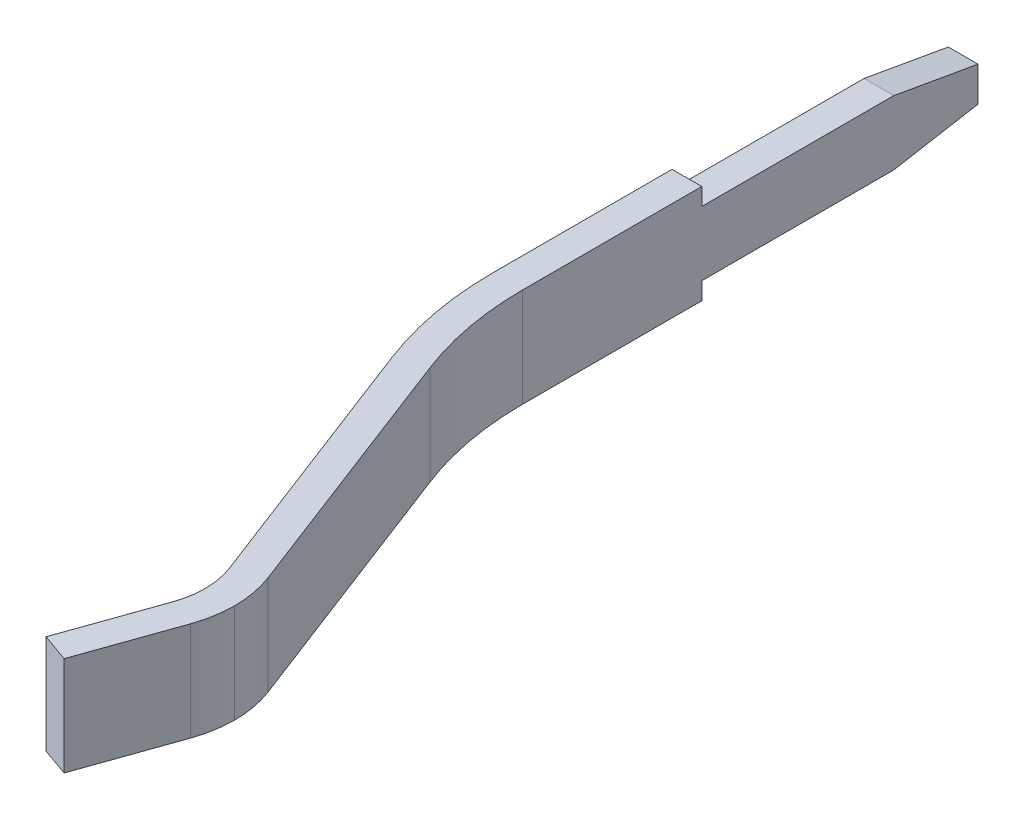
ISO-10303-21;
HEADER;
FILE_DESCRIPTION(('STEP AP214'),'2;1');
FILE_NAME('part.step','',(''),(''),'','','');
FILE_SCHEMA(('AUTOMOTIVE_DESIGN { 1 0 10303 214 1 1 1 1 }'));
ENDSEC;
DATA;
#1=APPLICATION_CONTEXT('core data for automotive mechanical design processes');
#2=APPLICATION_PROTOCOL_DEFINITION('international standard','automotive_design',2000,#1);
#3=PRODUCT_CONTEXT('',#1,'mechanical');
#4=PRODUCT('Part','Part','',(#3));
#5=PRODUCT_RELATED_PRODUCT_CATEGORY('part','',(#4));
#6=PRODUCT_DEFINITION_FORMATION('','',#4);
#7=PRODUCT_DEFINITION_CONTEXT('part definition',#1,'design');
#8=PRODUCT_DEFINITION('design','',#6,#7);
#9=PRODUCT_DEFINITION_SHAPE('','',#8);
#10=(LENGTH_UNIT() NAMED_UNIT(*) SI_UNIT(.MILLI.,.METRE.));
#11=(NAMED_UNIT(*) PLANE_ANGLE_UNIT() SI_UNIT($,.RADIAN.));
#12=(NAMED_UNIT(*) SI_UNIT($,.STERADIAN.) SOLID_ANGLE_UNIT());
#13=UNCERTAINTY_MEASURE_WITH_UNIT(LENGTH_MEASURE(1.E-05),#10,'distance_accuracy_value','');
#14=(GEOMETRIC_REPRESENTATION_CONTEXT(3) GLOBAL_UNCERTAINTY_ASSIGNED_CONTEXT((#13)) GLOBAL_UNIT_ASSIGNED_CONTEXT((#10,
#11,#12)) REPRESENTATION_CONTEXT('',''));
#15=CARTESIAN_POINT('',(0.,0.,0.));
#16=DIRECTION('',(0.,0.,1.));
#17=DIRECTION('',(1.,0.,0.));
#18=AXIS2_PLACEMENT_3D('',#15,#16,#17);
#19=CARTESIAN_POINT('',(137.95048954306,19.902694125595,6.525238669739));
#20=DIRECTION('',(-4.371138828674E-08,1.,0.));
#21=DIRECTION('',(1.,4.37113882867399E-08,-4.37114091299599E-08));
#22=AXIS2_PLACEMENT_3D('',#19,#20,#21);
#23=CYLINDRICAL_SURFACE('',#22,0.85);
#24=CARTESIAN_POINT('',(138.75187724079,19.9026941606245,6.80857196804195));
#25=CARTESIAN_POINT('',(138.800489549435,19.9026941627494,6.67107557654959));
#26=CARTESIAN_POINT('',(138.80048954306,19.9026941627494,6.525238632584));
#27=B_SPLINE_CURVE_WITH_KNOTS('',2,(#24,#25,#26),.UNSPECIFIED.,.F.,.F.,(3,3),(0.,1.),.UNSPECIFIED.);
#28=CARTESIAN_POINT('',(138.751877240787,19.9026941606248,6.80857196804103));
#29=VERTEX_POINT('',#28);
#30=CARTESIAN_POINT('',(138.80048954306,19.9026941627497,6.5252386325842));
#31=VERTEX_POINT('',#30);
#32=EDGE_CURVE('E1189',#29,#31,#27,.T.);
#33=ORIENTED_EDGE('',*,*,#32,.F.);
#34=CARTESIAN_POINT('',(138.75187724079,19.902694160625,6.80857196804194));
#35=DIRECTION('',(-4.37113956142098E-08,0.999999999999999,0.));
#36=VECTOR('',#35,1.);
#37=LINE('',#34,#36);
#38=CARTESIAN_POINT('',(138.751877197074,20.9026941606248,6.80857196804246));
#39=VERTEX_POINT('',#38);
#40=EDGE_CURVE('E163',#29,#39,#37,.T.);
#41=ORIENTED_EDGE('',*,*,#40,.T.);
#42=CARTESIAN_POINT('',(138.80048949934,20.9026941627494,6.525238632584));
#43=CARTESIAN_POINT('',(138.800489505715,20.9026941627494,6.67107557654959));
#44=CARTESIAN_POINT('',(138.75187719707,20.9026941606245,6.80857196804195));
#45=B_SPLINE_CURVE_WITH_KNOTS('',2,(#42,#43,#44),.UNSPECIFIED.,.F.,.F.,(3,3),(0.,1.),.UNSPECIFIED.);
#46=CARTESIAN_POINT('',(138.800489499346,20.9026941627497,6.5252386325842));
#47=VERTEX_POINT('',#46);
#48=EDGE_CURVE('E154',#47,#39,#45,.T.);
#49=ORIENTED_EDGE('',*,*,#48,.F.);
#50=CARTESIAN_POINT('',(138.800489499349,20.90269416275,6.5252386325843));
#51=DIRECTION('',(4.37113678586342E-08,-0.999999999999999,0.));
#52=VECTOR('',#51,1.);
#53=LINE('',#50,#52);
#54=EDGE_CURVE('E160',#47,#31,#53,.T.);
#55=ORIENTED_EDGE('',*,*,#54,.T.);
#56=EDGE_LOOP('',(#33,#41,#49,#55));
#57=FACE_BOUND('',#56,.T.);
#58=ADVANCED_FACE('F18',(#57),#23,.F.);
#59=CARTESIAN_POINT('',(140.60074239434,19.902694241441,0.499993243463));
#60=DIRECTION('',(4.37114091771E-08,0.,1.));
#61=DIRECTION('',(4.37113882867448E-08,-1.,0.));
#62=AXIS2_PLACEMENT_3D('',#59,#60,#61);
#63=PLANE('',#62);
#64=CARTESIAN_POINT('',(137.49187696503,19.9026941055481,0.49999337935589));
#65=DIRECTION('',(0.999999999999998,4.37113886753126E-08,-4.37114175873706E-08));
#66=VECTOR('',#65,1.);
#67=LINE('',#64,#66);
#68=CARTESIAN_POINT('',(137.491876965027,19.9026941055486,0.499993379355944));
#69=VERTEX_POINT('',#68);
#70=CARTESIAN_POINT('',(137.791876965031,19.9026941186618,0.499993366242733));
#71=VERTEX_POINT('',#70);
#72=EDGE_CURVE('E961',#69,#71,#67,.T.);
#73=ORIENTED_EDGE('',*,*,#72,.F.);
#74=CARTESIAN_POINT('',(137.49187696503,19.902694105549,0.499993379355889));
#75=DIRECTION('',(-4.37113837189628E-08,0.999999999999999,0.));
#76=VECTOR('',#75,1.);
#77=LINE('',#74,#76);
#78=CARTESIAN_POINT('',(137.491876957379,20.0776941055486,0.499993379355945));
#79=VERTEX_POINT('',#78);
#80=EDGE_CURVE('E1150',#69,#79,#77,.T.);
#81=ORIENTED_EDGE('',*,*,#80,.T.);
#82=CARTESIAN_POINT('',(137.49187695738,20.0776941055482,0.499993379355889));
#83=DIRECTION('',(0.999999999999998,4.37113886753126E-08,-4.37114092751539E-08));
#84=VECTOR('',#83,1.);
#85=LINE('',#82,#84);
#86=CARTESIAN_POINT('',(137.791876957381,20.0776941186618,0.499993366242733));
#87=VERTEX_POINT('',#86);
#88=EDGE_CURVE('E1140',#79,#87,#85,.T.);
#89=ORIENTED_EDGE('',*,*,#88,.T.);
#90=CARTESIAN_POINT('',(137.791876965032,19.902694118662,0.499993366242996));
#91=DIRECTION('',(-4.37113837189636E-08,0.999999999999999,0.));
#92=VECTOR('',#91,1.);
#93=LINE('',#90,#92);
#94=EDGE_CURVE('E167',#71,#87,#93,.T.);
#95=ORIENTED_EDGE('',*,*,#94,.F.);
#96=EDGE_LOOP('',(#73,#81,#89,#95));
#97=FACE_BOUND('',#96,.T.);
#98=ADVANCED_FACE('F1110',(#97),#63,.F.);
#99=CARTESIAN_POINT('',(140.60074230189,20.077694241441,-1.440006756537));
#100=DIRECTION('',(-4.371138828674E-08,1.,0.));
#101=DIRECTION('',(0.,0.,1.));
#102=AXIS2_PLACEMENT_3D('',#99,#100,#101);
#103=PLANE('',#102);
#104=ORIENTED_EDGE('',*,*,#88,.F.);
#105=CARTESIAN_POINT('',(137.49187695738,20.0776941055482,0.499993379356));
#106=DIRECTION('',(-4.37114119241873E-08,0.,-0.999999999999999));
#107=VECTOR('',#106,1.);
#108=LINE('',#105,#107);
#109=CARTESIAN_POINT('',(137.491876872579,20.0776941055485,-1.44000662064406));
#110=VERTEX_POINT('',#109);
#111=EDGE_CURVE('E1301',#79,#110,#108,.T.);
#112=ORIENTED_EDGE('',*,*,#111,.T.);
#113=CARTESIAN_POINT('',(137.49187687258,20.0776941055482,-1.44000662064411));
#114=DIRECTION('',(0.999999999999998,4.37113886753167E-08,-4.37114096365587E-08));
#115=VECTOR('',#114,1.);
#116=LINE('',#113,#115);
#117=CARTESIAN_POINT('',(137.791876872581,20.0776941186617,-1.44000663375719));
#118=VERTEX_POINT('',#117);
#119=EDGE_CURVE('E1078',#110,#118,#116,.T.);
#120=ORIENTED_EDGE('',*,*,#119,.T.);
#121=CARTESIAN_POINT('',(137.79187687258,20.0776941186616,-1.440006633757));
#122=DIRECTION('',(4.37114119241873E-08,0.,0.999999999999999));
#123=VECTOR('',#122,1.);
#124=LINE('',#121,#123);
#125=EDGE_CURVE('E329',#118,#87,#124,.T.);
#126=ORIENTED_EDGE('',*,*,#125,.T.);
#127=EDGE_LOOP('',(#104,#112,#120,#126));
#128=FACE_BOUND('',#127,.T.);
#129=ADVANCED_FACE('F1102',(#128),#103,.F.);
#130=CARTESIAN_POINT('',(140.60074225818,20.227694241441,-2.290006756537));
#131=DIRECTION('',(-3.54498546784081E-08,0.984783558817946,0.173785333908991));
#132=DIRECTION('',(0.999999999999979,0.,2.03986457781138E-07));
#133=AXIS2_PLACEMENT_3D('',#130,#131,#132);
#134=PLANE('',#133);
#135=ORIENTED_EDGE('',*,*,#119,.F.);
#136=CARTESIAN_POINT('',(137.491876872581,20.0776941055482,-1.44000662064413));
#137=DIRECTION('',(-5.06426632163062E-08,0.173785333908988,-0.984783558817946));
#138=VECTOR('',#137,1.);
#139=LINE('',#136,#138);
#140=CARTESIAN_POINT('',(137.491876828867,20.2276941055486,-2.2900066206439));
#141=VERTEX_POINT('',#140);
#142=EDGE_CURVE('E1067',#110,#141,#139,.T.);
#143=ORIENTED_EDGE('',*,*,#142,.T.);
#144=CARTESIAN_POINT('',(137.49187682887,20.2276941055482,-2.29000662064411));
#145=DIRECTION('',(0.999999999999998,4.37113886753167E-08,-4.37114089137572E-08));
#146=VECTOR('',#145,1.);
#147=LINE('',#144,#146);
#148=CARTESIAN_POINT('',(137.791876828869,20.2276941186618,-2.2900066337571));
#149=VERTEX_POINT('',#148);
#150=EDGE_CURVE('E480',#141,#149,#147,.T.);
#151=ORIENTED_EDGE('',*,*,#150,.T.);
#152=CARTESIAN_POINT('',(137.79187682887,20.2276941186615,-2.29000663375709));
#153=DIRECTION('',(5.06426632163063E-08,-0.173785333908988,0.984783558817946));
#154=VECTOR('',#153,1.);
#155=LINE('',#152,#154);
#156=EDGE_CURVE('E318',#149,#118,#155,.T.);
#157=ORIENTED_EDGE('',*,*,#156,.T.);
#158=EDGE_LOOP('',(#135,#143,#151,#157));
#159=FACE_BOUND('',#158,.T.);
#160=ADVANCED_FACE('F975',(#159),#134,.F.);
#161=CARTESIAN_POINT('',(140.99187704415,19.902694258538,2.309993226366));
#162=DIRECTION('',(4.371138828674E-08,-1.,0.));
#163=DIRECTION('',(0.,0.,-1.));
#164=AXIS2_PLACEMENT_3D('',#161,#162,#163);
#165=PLANE('',#164);
#166=CARTESIAN_POINT('',(140.99187704415,19.902694258538,2.309993226366));
#167=DIRECTION('',(-4.371138828674E-08,1.,0.));
#168=DIRECTION('',(-0.999999999999998,-4.37113886753159E-08,4.3711411226721E-08));
#169=AXIS2_PLACEMENT_3D('',#166,#167,#168);
#170=CIRCLE('',#169,3.50000000000001);
#171=CARTESIAN_POINT('',(137.491877044146,19.9026941055486,2.30999337935598));
#172=VERTEX_POINT('',#171);
#173=CARTESIAN_POINT('',(137.724350529752,19.90269411571,3.56429401873106));
#174=VERTEX_POINT('',#173);
#175=EDGE_CURVE('E1270',#172,#174,#170,.T.);
#176=ORIENTED_EDGE('',*,*,#175,.F.);
#177=CARTESIAN_POINT('',(137.491877044143,19.9026941055481,2.309993379356));
#178=DIRECTION('',(-4.3711412635585E-08,0.,-0.999999999999999));
#179=VECTOR('',#178,1.);
#180=LINE('',#177,#179);
#181=EDGE_CURVE('E1044',#172,#69,#180,.T.);
#182=ORIENTED_EDGE('',*,*,#181,.T.);
#183=ORIENTED_EDGE('',*,*,#72,.T.);
#184=CARTESIAN_POINT('',(137.791876965032,19.9026941186616,0.499993366243));
#185=DIRECTION('',(4.37113973010128E-08,0.,0.999999999999999));
#186=VECTOR('',#185,1.);
#187=LINE('',#184,#186);
#188=CARTESIAN_POINT('',(137.79187704415,19.9026941186618,2.30999336624283));
#189=VERTEX_POINT('',#188);
#190=EDGE_CURVE('E350',#71,#189,#187,.T.);
#191=ORIENTED_EDGE('',*,*,#190,.T.);
#192=CARTESIAN_POINT('',(137.79187704415,19.9026941186616,2.30999336624251));
#193=CARTESIAN_POINT('',(137.791877070075,19.9026941186616,2.90308480629358));
#194=CARTESIAN_POINT('',(138.00442423099,19.9026941279523,3.45678252224412));
#195=B_SPLINE_CURVE_WITH_KNOTS('',2,(#192,#193,#194),.UNSPECIFIED.,.F.,.F.,(3,3),(0.,1.),.UNSPECIFIED.);
#196=CARTESIAN_POINT('',(138.00442423099,19.9026941279526,3.45678252224407));
#197=VERTEX_POINT('',#196);
#198=EDGE_CURVE('E929',#189,#197,#195,.T.);
#199=ORIENTED_EDGE('',*,*,#198,.T.);
#200=CARTESIAN_POINT('',(138.00442423099,19.9026941279523,3.45678252224402));
#201=DIRECTION('',(0.358371654961849,1.56649226558016E-08,0.933579004112617));
#202=VECTOR('',#201,1.);
#203=LINE('',#200,#202);
#204=CARTESIAN_POINT('',(139.02410539779,19.9026941725241,6.11311126653308));
#205=VERTEX_POINT('',#204);
#206=EDGE_CURVE('E1199',#197,#205,#203,.T.);
#207=ORIENTED_EDGE('',*,*,#206,.T.);
#208=CARTESIAN_POINT('',(137.95048954306,19.902694125595,6.525238669739));
#209=DIRECTION('',(-4.371138828674E-08,1.,0.));
#210=DIRECTION('',(0.999999999999998,4.37113871668603E-08,-4.37114090394606E-08));
#211=AXIS2_PLACEMENT_3D('',#208,#209,#210);
#212=CIRCLE('',#211,1.15000000000001);
#213=CARTESIAN_POINT('',(139.10048954306,19.902694175863,6.52523861947092));
#214=VERTEX_POINT('',#213);
#215=EDGE_CURVE('E838',#214,#205,#212,.T.);
#216=ORIENTED_EDGE('',*,*,#215,.F.);
#217=CARTESIAN_POINT('',(137.95048954306,19.902694125595,6.525238669739));
#218=DIRECTION('',(-4.371138828674E-08,1.,0.));
#219=DIRECTION('',(0.942809056152033,4.12114937586378E-08,0.333333292123231));
#220=AXIS2_PLACEMENT_3D('',#217,#218,#219);
#221=CIRCLE('',#220,1.15);
#222=CARTESIAN_POINT('',(139.034719957634,19.902694172988,6.90857195568044));
#223=VERTEX_POINT('',#222);
#224=EDGE_CURVE('E782',#223,#214,#221,.T.);
#225=ORIENTED_EDGE('',*,*,#224,.F.);
#226=CARTESIAN_POINT('',(139.034719957633,19.9026941729879,6.90857195568016));
#227=DIRECTION('',(-0.33333329212183,-1.45704604862449E-08,0.942809056152529));
#228=VECTOR('',#227,1.);
#229=LINE('',#226,#228);
#230=CARTESIAN_POINT('',(138.70187728631,19.902694158439,7.849993326465));
#231=VERTEX_POINT('',#230);
#232=EDGE_CURVE('E750',#223,#231,#229,.T.);
#233=ORIENTED_EDGE('',*,*,#232,.T.);
#234=CARTESIAN_POINT('',(138.70187728631,19.9026941584389,7.849993326465));
#235=DIRECTION('',(-0.942809056152521,-4.12114902383835E-08,-0.333333292121849));
#236=VECTOR('',#235,1.);
#237=LINE('',#234,#236);
#238=CARTESIAN_POINT('',(138.41903456946,19.9026941460757,7.74999333882809));
#239=VERTEX_POINT('',#238);
#240=EDGE_CURVE('E1225',#231,#239,#237,.T.);
#241=ORIENTED_EDGE('',*,*,#240,.T.);
#242=CARTESIAN_POINT('',(138.41903456946,19.9026941460755,7.749993338829));
#243=DIRECTION('',(0.333333292121842,1.45704604861822E-08,-0.942809056152525));
#244=VECTOR('',#243,1.);
#245=LINE('',#242,#244);
#246=EDGE_CURVE('E659',#239,#29,#245,.T.);
#247=ORIENTED_EDGE('',*,*,#246,.T.);
#248=ORIENTED_EDGE('',*,*,#32,.T.);
#249=CARTESIAN_POINT('',(138.80048954306,19.9026941627494,6.525238632584));
#250=CARTESIAN_POINT('',(138.800489536174,19.9026941627494,6.36769871881936));
#251=CARTESIAN_POINT('',(138.744031696555,19.9026941602816,6.22062276301914));
#252=B_SPLINE_CURVE_WITH_KNOTS('',2,(#249,#250,#251),.UNSPECIFIED.,.F.,.F.,(3,3),(0.,1.),.UNSPECIFIED.);
#253=CARTESIAN_POINT('',(138.744031696552,19.9026941602818,6.22062276302006));
#254=VERTEX_POINT('',#253);
#255=EDGE_CURVE('E178',#31,#254,#252,.T.);
#256=ORIENTED_EDGE('',*,*,#255,.T.);
#257=CARTESIAN_POINT('',(138.74403169655,19.9026941602816,6.22062276302098));
#258=DIRECTION('',(-0.35837165496185,-1.56649226558017E-08,-0.933579004112617));
#259=VECTOR('',#258,1.);
#260=LINE('',#257,#259);
#261=EDGE_CURVE('E581',#254,#174,#260,.T.);
#262=ORIENTED_EDGE('',*,*,#261,.T.);
#263=EDGE_LOOP('',(#176,#182,#183,#191,#199,#207,#216,#225,#233,#241,#247,#248,#256,#262));
#264=FACE_BOUND('',#263,.T.);
#265=ADVANCED_FACE('F966',(#264),#165,.T.);
#266=CARTESIAN_POINT('',(140.99187704415,19.902694258538,2.309993226366));
#267=DIRECTION('',(-4.371138828674E-08,1.,0.));
#268=DIRECTION('',(1.,4.37113882867399E-08,-4.37114091299599E-08));
#269=AXIS2_PLACEMENT_3D('',#266,#267,#268);
#270=CYLINDRICAL_SURFACE('',#269,3.2);
#271=CARTESIAN_POINT('',(138.004424187278,20.902694127953,3.45678252224412));
#272=DIRECTION('',(4.37113956142098E-08,-0.999999999999999,0.));
#273=VECTOR('',#272,1.);
#274=LINE('',#271,#273);
#275=CARTESIAN_POINT('',(138.004424187275,20.9026941279525,3.4567825222431));
#276=VERTEX_POINT('',#275);
#277=EDGE_CURVE('E874',#276,#197,#274,.T.);
#278=ORIENTED_EDGE('',*,*,#277,.T.);
#279=ORIENTED_EDGE('',*,*,#198,.F.);
#280=CARTESIAN_POINT('',(137.79187704415,19.902694118662,2.309993366243));
#281=DIRECTION('',(-4.37113678586342E-08,0.999999999999999,0.));
#282=VECTOR('',#281,1.);
#283=LINE('',#280,#282);
#284=CARTESIAN_POINT('',(137.791877000436,20.9026941186618,2.30999336624283));
#285=VERTEX_POINT('',#284);
#286=EDGE_CURVE('E360',#189,#285,#283,.T.);
#287=ORIENTED_EDGE('',*,*,#286,.T.);
#288=CARTESIAN_POINT('',(140.991877000439,20.902694258538,2.309993226366));
#289=DIRECTION('',(-4.371138828674E-08,1.,0.));
#290=DIRECTION('',(-0.999999999999998,-4.37113886753162E-08,4.37114111725112E-08));
#291=AXIS2_PLACEMENT_3D('',#288,#289,#290);
#292=CIRCLE('',#291,3.19999999999999);
#293=EDGE_CURVE('E948',#285,#276,#292,.T.);
#294=ORIENTED_EDGE('',*,*,#293,.T.);
#295=EDGE_LOOP('',(#278,#279,#287,#294));
#296=FACE_BOUND('',#295,.T.);
#297=ADVANCED_FACE('F889',(#296),#270,.F.);
#298=CARTESIAN_POINT('',(139.02410539779,19.902694172524,6.113111266533));
#299=DIRECTION('',(-0.933579004112615,-4.08080343451031E-08,0.358371654961852));
#300=DIRECTION('',(-4.37113882867278E-08,1.,0.));
#301=AXIS2_PLACEMENT_3D('',#298,#299,#300);
#302=PLANE('',#301);
#303=CARTESIAN_POINT('',(139.02410539779,19.902694172524,6.11311126653315));
#304=DIRECTION('',(-4.37113956142098E-08,0.999999999999999,0.));
#305=VECTOR('',#304,1.);
#306=LINE('',#303,#305);
#307=CARTESIAN_POINT('',(139.024105354075,20.9026941725241,6.11311126653211));
#308=VERTEX_POINT('',#307);
#309=EDGE_CURVE('E849',#205,#308,#306,.T.);
#310=ORIENTED_EDGE('',*,*,#309,.F.);
#311=ORIENTED_EDGE('',*,*,#206,.F.);
#312=ORIENTED_EDGE('',*,*,#277,.F.);
#313=CARTESIAN_POINT('',(138.004424187277,20.9026941279523,3.45678252224113));
#314=DIRECTION('',(0.358371654961849,1.56649226558016E-08,0.933579004112617));
#315=VECTOR('',#314,1.);
#316=LINE('',#313,#315);
#317=EDGE_CURVE('E908',#276,#308,#316,.T.);
#318=ORIENTED_EDGE('',*,*,#317,.T.);
#319=EDGE_LOOP('',(#310,#311,#312,#318));
#320=FACE_BOUND('',#319,.T.);
#321=ADVANCED_FACE('F880',(#320),#302,.F.);
#322=CARTESIAN_POINT('',(137.95048954306,19.902694125595,6.525238669739));
#323=DIRECTION('',(-4.371138828674E-08,1.,0.));
#324=DIRECTION('',(1.,4.37113882867399E-08,-4.37114091299599E-08));
#325=AXIS2_PLACEMENT_3D('',#322,#323,#324);
#326=CYLINDRICAL_SURFACE('',#325,1.15);
#327=ORIENTED_EDGE('',*,*,#309,.T.);
#328=CARTESIAN_POINT('',(137.950489499349,20.902694125595,6.525238669739));
#329=DIRECTION('',(4.371138828674E-08,-1.,0.));
#330=DIRECTION('',(0.933579004111747,4.08080332810503E-08,-0.358371654964112));
#331=AXIS2_PLACEMENT_3D('',#328,#329,#330);
#332=CIRCLE('',#331,1.15);
#333=CARTESIAN_POINT('',(139.100489499346,20.902694175863,6.52523861947092));
#334=VERTEX_POINT('',#333);
#335=EDGE_CURVE('E860',#308,#334,#332,.T.);
#336=ORIENTED_EDGE('',*,*,#335,.T.);
#337=CARTESIAN_POINT('',(139.10048954306,19.902694175863,6.52523861947087));
#338=DIRECTION('',(-4.37113956142098E-08,0.999999999999999,0.));
#339=VECTOR('',#338,1.);
#340=LINE('',#337,#339);
#341=EDGE_CURVE('E827',#214,#334,#340,.T.);
#342=ORIENTED_EDGE('',*,*,#341,.F.);
#343=ORIENTED_EDGE('',*,*,#215,.T.);
#344=EDGE_LOOP('',(#327,#336,#342,#343));
#345=FACE_BOUND('',#344,.T.);
#346=ADVANCED_FACE('F796',(#345),#326,.T.);
#347=CARTESIAN_POINT('',(137.95048954306,19.902694125595,6.525238669739));
#348=DIRECTION('',(-4.371138828674E-08,1.,0.));
#349=DIRECTION('',(1.,4.37113882867399E-08,-4.37114091299599E-08));
#350=AXIS2_PLACEMENT_3D('',#347,#348,#349);
#351=CYLINDRICAL_SURFACE('',#350,1.15);
#352=CARTESIAN_POINT('',(137.950489499349,20.902694125595,6.525238669739));
#353=DIRECTION('',(4.371138828674E-08,-1.,0.));
#354=DIRECTION('',(0.999999999999998,4.37113871668603E-08,-4.37114135648262E-08));
#355=AXIS2_PLACEMENT_3D('',#352,#353,#354);
#356=CIRCLE('',#355,1.15000000000001);
#357=CARTESIAN_POINT('',(139.034719913922,20.902694172988,6.90857195567977));
#358=VERTEX_POINT('',#357);
#359=EDGE_CURVE('E1727',#334,#358,#356,.T.);
#360=ORIENTED_EDGE('',*,*,#359,.T.);
#361=CARTESIAN_POINT('',(139.034719913923,20.902694172988,6.90857195568072));
#362=DIRECTION('',(4.37113956142098E-08,-0.999999999999999,0.));
#363=VECTOR('',#362,1.);
#364=LINE('',#361,#363);
#365=EDGE_CURVE('E739',#358,#223,#364,.T.);
#366=ORIENTED_EDGE('',*,*,#365,.T.);
#367=ORIENTED_EDGE('',*,*,#224,.T.);
#368=ORIENTED_EDGE('',*,*,#341,.T.);
#369=EDGE_LOOP('',(#360,#366,#367,#368));
#370=FACE_BOUND('',#369,.T.);
#371=ADVANCED_FACE('F787',(#370),#351,.T.);
#372=CARTESIAN_POINT('',(138.70187728631,19.902694158439,7.849993326465));
#373=DIRECTION('',(-0.942809056152527,-4.12114927337194E-08,-0.333333292121833));
#374=DIRECTION('',(-0.333333292121833,0.,0.942809056152528));
#375=AXIS2_PLACEMENT_3D('',#372,#373,#374);
#376=PLANE('',#375);
#377=CARTESIAN_POINT('',(138.701877242599,20.902694158439,7.849993326465));
#378=DIRECTION('',(4.371139561421E-08,-0.999999999999999,0.));
#379=VECTOR('',#378,1.);
#380=LINE('',#377,#379);
#381=CARTESIAN_POINT('',(138.701877242599,20.902694158439,7.849993326465));
#382=VERTEX_POINT('',#381);
#383=EDGE_CURVE('E691',#382,#231,#380,.T.);
#384=ORIENTED_EDGE('',*,*,#383,.T.);
#385=ORIENTED_EDGE('',*,*,#232,.F.);
#386=ORIENTED_EDGE('',*,*,#365,.F.);
#387=CARTESIAN_POINT('',(139.034719913922,20.902694172988,6.90857195567972));
#388=DIRECTION('',(-0.33333329212183,-1.45704639608059E-08,0.942809056152529));
#389=VECTOR('',#388,1.);
#390=LINE('',#387,#389);
#391=EDGE_CURVE('E769',#358,#382,#390,.T.);
#392=ORIENTED_EDGE('',*,*,#391,.T.);
#393=EDGE_LOOP('',(#384,#385,#386,#392));
#394=FACE_BOUND('',#393,.T.);
#395=ADVANCED_FACE('F706',(#394),#376,.F.);
#396=CARTESIAN_POINT('',(138.70187728631,19.902694158439,7.849993326465));
#397=DIRECTION('',(0.333333292121833,1.45704609608227E-08,-0.942809056152528));
#398=DIRECTION('',(0.,-1.,-1.54543073867817E-08));
#399=AXIS2_PLACEMENT_3D('',#396,#397,#398);
#400=PLANE('',#399);
#401=CARTESIAN_POINT('',(138.419034525749,20.902694146076,7.74999333882717));
#402=DIRECTION('',(4.37113956142098E-08,-0.999999999999999,0.));
#403=VECTOR('',#402,1.);
#404=LINE('',#401,#403);
#405=CARTESIAN_POINT('',(138.41903452575,20.9026941460758,7.74999333882809));
#406=VERTEX_POINT('',#405);
#407=EDGE_CURVE('E648',#406,#239,#404,.T.);
#408=ORIENTED_EDGE('',*,*,#407,.T.);
#409=ORIENTED_EDGE('',*,*,#240,.F.);
#410=ORIENTED_EDGE('',*,*,#383,.F.);
#411=CARTESIAN_POINT('',(138.7018772426,20.902694158439,7.84999332646543));
#412=DIRECTION('',(-0.942809056152526,-4.12114902383837E-08,-0.333333292121837));
#413=VECTOR('',#412,1.);
#414=LINE('',#411,#413);
#415=EDGE_CURVE('E725',#382,#406,#414,.T.);
#416=ORIENTED_EDGE('',*,*,#415,.T.);
#417=EDGE_LOOP('',(#408,#409,#410,#416));
#418=FACE_BOUND('',#417,.T.);
#419=ADVANCED_FACE('F697',(#418),#400,.F.);
#420=CARTESIAN_POINT('',(138.41903456946,19.902694146076,7.749993338829));
#421=DIRECTION('',(0.942809056152527,4.12114927337194E-08,0.333333292121833));
#422=DIRECTION('',(0.,-1.,1.23634493486646E-07));
#423=AXIS2_PLACEMENT_3D('',#420,#421,#422);
#424=PLANE('',#423);
#425=ORIENTED_EDGE('',*,*,#40,.F.);
#426=ORIENTED_EDGE('',*,*,#246,.F.);
#427=ORIENTED_EDGE('',*,*,#407,.F.);
#428=CARTESIAN_POINT('',(138.419034525749,20.902694146076,7.74999333882856));
#429=DIRECTION('',(0.333333292121817,1.45704535371089E-08,-0.942809056152534));
#430=VECTOR('',#429,1.);
#431=LINE('',#428,#430);
#432=EDGE_CURVE('E191',#406,#39,#431,.T.);
#433=ORIENTED_EDGE('',*,*,#432,.T.);
#434=EDGE_LOOP('',(#425,#426,#427,#433));
#435=FACE_BOUND('',#434,.T.);
#436=ADVANCED_FACE('F619',(#435),#424,.F.);
#437=CARTESIAN_POINT('',(137.95048954306,19.902694125595,6.525238669739));
#438=DIRECTION('',(-4.371138828674E-08,1.,0.));
#439=DIRECTION('',(1.,4.37113882867399E-08,-4.37114091299599E-08));
#440=AXIS2_PLACEMENT_3D('',#437,#438,#439);
#441=CYLINDRICAL_SURFACE('',#440,0.85);
#442=ORIENTED_EDGE('',*,*,#54,.F.);
#443=CARTESIAN_POINT('',(137.950489499349,20.902694125595,6.525238669739));
#444=DIRECTION('',(-4.371138828674E-08,1.,0.));
#445=DIRECTION('',(0.999999999999998,4.37113866344639E-08,-4.37114090838265E-08));
#446=AXIS2_PLACEMENT_3D('',#443,#444,#445);
#447=CIRCLE('',#446,0.850000000000019);
#448=CARTESIAN_POINT('',(138.74403165284,20.9026941602818,6.22062276302077));
#449=VERTEX_POINT('',#448);
#450=EDGE_CURVE('E175',#47,#449,#447,.T.);
#451=ORIENTED_EDGE('',*,*,#450,.T.);
#452=CARTESIAN_POINT('',(138.744031652843,20.902694160282,6.22062276301914));
#453=DIRECTION('',(4.37113678586342E-08,-0.999999999999999,0.));
#454=VECTOR('',#453,1.);
#455=LINE('',#452,#454);
#456=EDGE_CURVE('E571',#449,#254,#455,.T.);
#457=ORIENTED_EDGE('',*,*,#456,.T.);
#458=ORIENTED_EDGE('',*,*,#255,.F.);
#459=EDGE_LOOP('',(#442,#451,#457,#458));
#460=FACE_BOUND('',#459,.T.);
#461=ADVANCED_FACE('F173',(#460),#441,.F.);
#462=CARTESIAN_POINT('',(137.72435052975,19.90269411571,3.564294018732));
#463=DIRECTION('',(0.933579004112615,4.08080343451031E-08,-0.358371654961852));
#464=DIRECTION('',(0.,-1.,-1.13870708746334E-07));
#465=AXIS2_PLACEMENT_3D('',#462,#463,#464);
#466=PLANE('',#465);
#467=CARTESIAN_POINT('',(137.724350529755,19.90269411571,3.56429401873013));
#468=DIRECTION('',(-4.37113678586342E-08,0.999999999999999,0.));
#469=VECTOR('',#468,1.);
#470=LINE('',#467,#469);
#471=CARTESIAN_POINT('',(137.72435048604,20.90269411571,3.56429401873177));
#472=VERTEX_POINT('',#471);
#473=EDGE_CURVE('E559',#174,#472,#470,.T.);
#474=ORIENTED_EDGE('',*,*,#473,.F.);
#475=ORIENTED_EDGE('',*,*,#261,.F.);
#476=ORIENTED_EDGE('',*,*,#456,.F.);
#477=CARTESIAN_POINT('',(138.744031652839,20.9026941602817,6.22062276302146));
#478=DIRECTION('',(-0.358371654961848,-1.56649214364484E-08,-0.933579004112617));
#479=VECTOR('',#478,1.);
#480=LINE('',#477,#479);
#481=EDGE_CURVE('E188',#449,#472,#480,.T.);
#482=ORIENTED_EDGE('',*,*,#481,.T.);
#483=EDGE_LOOP('',(#474,#475,#476,#482));
#484=FACE_BOUND('',#483,.T.);
#485=ADVANCED_FACE('F538',(#484),#466,.F.);
#486=CARTESIAN_POINT('',(140.99187704415,19.902694258538,2.309993226366));
#487=DIRECTION('',(-4.371138828674E-08,1.,0.));
#488=DIRECTION('',(1.,4.37113882867399E-08,-4.37114091299599E-08));
#489=AXIS2_PLACEMENT_3D('',#486,#487,#488);
#490=CYLINDRICAL_SURFACE('',#489,3.5);
#491=ORIENTED_EDGE('',*,*,#175,.T.);
#492=ORIENTED_EDGE('',*,*,#473,.T.);
#493=CARTESIAN_POINT('',(140.991877000439,20.902694258538,2.309993226366));
#494=DIRECTION('',(4.371138828674E-08,-1.,0.));
#495=DIRECTION('',(-0.933579004112822,-4.08080345309131E-08,0.358371654961311));
#496=AXIS2_PLACEMENT_3D('',#493,#494,#495);
#497=CIRCLE('',#496,3.5);
#498=CARTESIAN_POINT('',(137.491877000434,20.9026941055486,2.30999337935598));
#499=VERTEX_POINT('',#498);
#500=EDGE_CURVE('E524',#472,#499,#497,.T.);
#501=ORIENTED_EDGE('',*,*,#500,.T.);
#502=CARTESIAN_POINT('',(137.491877000439,20.902694105549,2.30999337935599));
#503=DIRECTION('',(4.37113956142098E-08,-0.999999999999999,0.));
#504=VECTOR('',#503,1.);
#505=LINE('',#502,#504);
#506=EDGE_CURVE('E404',#499,#172,#505,.T.);
#507=ORIENTED_EDGE('',*,*,#506,.T.);
#508=EDGE_LOOP('',(#491,#492,#501,#507));
#509=FACE_BOUND('',#508,.T.);
#510=ADVANCED_FACE('F529',(#509),#490,.T.);
#511=CARTESIAN_POINT('',(137.79187684307,19.902694118662,-2.290006633757));
#512=DIRECTION('',(4.371140912996E-08,0.,1.));
#513=DIRECTION('',(4.37113882867346E-08,-1.,0.));
#514=AXIS2_PLACEMENT_3D('',#511,#512,#513);
#515=PLANE('',#514);
#516=CARTESIAN_POINT('',(137.49187681357,20.5776941055482,-2.29000662064358));
#517=DIRECTION('',(0.999999999999998,4.37113886753126E-08,-4.37114089137532E-08));
#518=VECTOR('',#517,1.);
#519=LINE('',#516,#518);
#520=CARTESIAN_POINT('',(137.491876813568,20.5776941055486,-2.29000662064386));
#521=VERTEX_POINT('',#520);
#522=CARTESIAN_POINT('',(137.79187681357,20.5776941186618,-2.29000663375709));
#523=VERTEX_POINT('',#522);
#524=EDGE_CURVE('E501',#521,#523,#519,.T.);
#525=ORIENTED_EDGE('',*,*,#524,.T.);
#526=CARTESIAN_POINT('',(137.791876813565,20.577694118662,-2.290006633757));
#527=DIRECTION('',(4.37113837189632E-08,-0.999999999999999,0.));
#528=VECTOR('',#527,1.);
#529=LINE('',#526,#528);
#530=EDGE_CURVE('E307',#523,#149,#529,.T.);
#531=ORIENTED_EDGE('',*,*,#530,.T.);
#532=ORIENTED_EDGE('',*,*,#150,.F.);
#533=CARTESIAN_POINT('',(137.491876828864,20.227694105549,-2.29000662064358));
#534=DIRECTION('',(-4.37113837189628E-08,0.999999999999999,0.));
#535=VECTOR('',#534,1.);
#536=LINE('',#533,#535);
#537=EDGE_CURVE('E511',#141,#521,#536,.T.);
#538=ORIENTED_EDGE('',*,*,#537,.T.);
#539=EDGE_LOOP('',(#525,#531,#532,#538));
#540=FACE_BOUND('',#539,.T.);
#541=ADVANCED_FACE('F419',(#540),#515,.F.);
#542=CARTESIAN_POINT('',(137.49187684307,19.902694105549,-2.290006620644));
#543=DIRECTION('',(1.,4.371138828674E-08,-4.37114091771E-08));
#544=DIRECTION('',(0.,-0.707106950155213,-0.707106612217841));
#545=AXIS2_PLACEMENT_3D('',#542,#543,#544);
#546=PLANE('',#545);
#547=CARTESIAN_POINT('',(137.49187692897,20.727694105549,0.499993379355889));
#548=DIRECTION('',(-4.37113837189628E-08,0.999999999999999,0.));
#549=VECTOR('',#548,1.);
#550=LINE('',#547,#549);
#551=CARTESIAN_POINT('',(137.491876928968,20.7276941055486,0.499993379355945));
#552=VERTEX_POINT('',#551);
#553=CARTESIAN_POINT('',(137.491876921317,20.9026941055486,0.499993379355944));
#554=VERTEX_POINT('',#553);
#555=EDGE_CURVE('E1317',#552,#554,#550,.T.);
#556=ORIENTED_EDGE('',*,*,#555,.F.);
#557=CARTESIAN_POINT('',(137.491876928963,20.727694105549,0.499993379356003));
#558=DIRECTION('',(-4.37114119241872E-08,0.,-0.999999999999999));
#559=VECTOR('',#558,1.);
#560=LINE('',#557,#559);
#561=CARTESIAN_POINT('',(137.491876844168,20.7276941055485,-1.44000662064401));
#562=VERTEX_POINT('',#561);
#563=EDGE_CURVE('E1664',#552,#562,#560,.T.);
#564=ORIENTED_EDGE('',*,*,#563,.T.);
#565=CARTESIAN_POINT('',(137.491876844163,20.727694105549,-1.440006620644));
#566=DIRECTION('',(-3.54498546043904E-08,-0.173785333908992,-0.984783558817946));
#567=VECTOR('',#566,1.);
#568=LINE('',#565,#567);
#569=EDGE_CURVE('E1643',#562,#521,#568,.T.);
#570=ORIENTED_EDGE('',*,*,#569,.T.);
#571=ORIENTED_EDGE('',*,*,#537,.F.);
#572=ORIENTED_EDGE('',*,*,#142,.F.);
#573=ORIENTED_EDGE('',*,*,#111,.F.);
#574=ORIENTED_EDGE('',*,*,#80,.F.);
#575=ORIENTED_EDGE('',*,*,#181,.F.);
#576=ORIENTED_EDGE('',*,*,#506,.F.);
#577=CARTESIAN_POINT('',(137.491877000431,20.902694105549,2.309993379356));
#578=DIRECTION('',(-4.3711412635585E-08,0.,-0.999999999999999));
#579=VECTOR('',#578,1.);
#580=LINE('',#577,#579);
#581=EDGE_CURVE('E468',#499,#554,#580,.T.);
#582=ORIENTED_EDGE('',*,*,#581,.T.);
#583=EDGE_LOOP('',(#556,#564,#570,#571,#572,#573,#574,#575,#576,#582));
#584=FACE_BOUND('',#583,.T.);
#585=ADVANCED_FACE('F410',(#584),#546,.F.);
#586=CARTESIAN_POINT('',(137.79187704415,19.902694118662,2.309993366243));
#587=DIRECTION('',(-1.,-4.37113882867399E-08,4.37114092478099E-08));
#588=DIRECTION('',(-4.371138828674E-08,1.,0.));
#589=AXIS2_PLACEMENT_3D('',#586,#587,#588);
#590=PLANE('',#589);
#591=CARTESIAN_POINT('',(137.79187692132,20.902694118662,0.499993366242466));
#592=DIRECTION('',(4.37113837189628E-08,-0.999999999999999,0.));
#593=VECTOR('',#592,1.);
#594=LINE('',#591,#593);
#595=CARTESIAN_POINT('',(137.791876921319,20.9026941186618,0.499993366242733));
#596=VERTEX_POINT('',#595);
#597=CARTESIAN_POINT('',(137.79187692897,20.7276941186618,0.499993366242733));
#598=VERTEX_POINT('',#597);
#599=EDGE_CURVE('E38',#596,#598,#594,.T.);
#600=ORIENTED_EDGE('',*,*,#599,.F.);
#601=CARTESIAN_POINT('',(137.791876921321,20.902694118662,0.499993366242996));
#602=DIRECTION('',(4.37114126355849E-08,0.,0.999999999999999));
#603=VECTOR('',#602,1.);
#604=LINE('',#601,#603);
#605=EDGE_CURVE('E280',#596,#285,#604,.T.);
#606=ORIENTED_EDGE('',*,*,#605,.T.);
#607=ORIENTED_EDGE('',*,*,#286,.F.);
#608=ORIENTED_EDGE('',*,*,#190,.F.);
#609=ORIENTED_EDGE('',*,*,#94,.T.);
#610=ORIENTED_EDGE('',*,*,#125,.F.);
#611=ORIENTED_EDGE('',*,*,#156,.F.);
#612=ORIENTED_EDGE('',*,*,#530,.F.);
#613=CARTESIAN_POINT('',(137.791876813572,20.577694118662,-2.29000663375701));
#614=DIRECTION('',(3.54498867611373E-08,0.173785333908986,0.984783558817947));
#615=VECTOR('',#614,1.);
#616=LINE('',#613,#615);
#617=CARTESIAN_POINT('',(137.79187684417,20.7276941186617,-1.44000663375717));
#618=VERTEX_POINT('',#617);
#619=EDGE_CURVE('E294',#523,#618,#616,.T.);
#620=ORIENTED_EDGE('',*,*,#619,.T.);
#621=CARTESIAN_POINT('',(137.79187684417,20.727694118662,-1.44000663375701));
#622=DIRECTION('',(4.37114119241872E-08,0.,0.999999999999999));
#623=VECTOR('',#622,1.);
#624=LINE('',#621,#623);
#625=EDGE_CURVE('E389',#618,#598,#624,.T.);
#626=ORIENTED_EDGE('',*,*,#625,.T.);
#627=EDGE_LOOP('',(#600,#606,#607,#608,#609,#610,#611,#612,#620,#626));
#628=FACE_BOUND('',#627,.T.);
#629=ADVANCED_FACE('F210',(#628),#590,.F.);
#630=CARTESIAN_POINT('',(140.99187700043,20.902694258538,2.309993226366));
#631=DIRECTION('',(4.371138828674E-08,-1.,0.));
#632=DIRECTION('',(0.,0.,-1.));
#633=AXIS2_PLACEMENT_3D('',#630,#631,#632);
#634=PLANE('',#633);
#635=CARTESIAN_POINT('',(137.79187692132,20.9026941186616,0.499993366242465));
#636=DIRECTION('',(-0.999999999999998,-4.37113886753126E-08,4.37114175873706E-08));
#637=VECTOR('',#636,1.);
#638=LINE('',#635,#637);
#639=EDGE_CURVE('E30',#596,#554,#638,.T.);
#640=ORIENTED_EDGE('',*,*,#639,.T.);
#641=ORIENTED_EDGE('',*,*,#581,.F.);
#642=ORIENTED_EDGE('',*,*,#500,.F.);
#643=ORIENTED_EDGE('',*,*,#481,.F.);
#644=ORIENTED_EDGE('',*,*,#450,.F.);
#645=ORIENTED_EDGE('',*,*,#48,.T.);
#646=ORIENTED_EDGE('',*,*,#432,.F.);
#647=ORIENTED_EDGE('',*,*,#415,.F.);
#648=ORIENTED_EDGE('',*,*,#391,.F.);
#649=ORIENTED_EDGE('',*,*,#359,.F.);
#650=ORIENTED_EDGE('',*,*,#335,.F.);
#651=ORIENTED_EDGE('',*,*,#317,.F.);
#652=ORIENTED_EDGE('',*,*,#293,.F.);
#653=ORIENTED_EDGE('',*,*,#605,.F.);
#654=EDGE_LOOP('',(#640,#641,#642,#643,#644,#645,#646,#647,#648,#649,#650,#651,#652,#653));
#655=FACE_BOUND('',#654,.T.);
#656=ADVANCED_FACE('F186',(#655),#634,.F.);
#657=CARTESIAN_POINT('',(140.60074227348,20.727694241441,-1.440006756537));
#658=DIRECTION('',(5.06426583573572E-08,-0.984783558817946,0.173785333908991));
#659=DIRECTION('',(-1.,-5.14251663768072E-08,0.));
#660=AXIS2_PLACEMENT_3D('',#657,#658,#659);
#661=PLANE('',#660);
#662=ORIENTED_EDGE('',*,*,#524,.F.);
#663=ORIENTED_EDGE('',*,*,#569,.F.);
#664=CARTESIAN_POINT('',(137.49187684417,20.7276941055482,-1.44000662064411));
#665=DIRECTION('',(0.999999999999998,4.37113886753167E-08,-4.37114096365587E-08));
#666=VECTOR('',#665,1.);
#667=LINE('',#664,#666);
#668=EDGE_CURVE('E1672',#562,#618,#667,.T.);
#669=ORIENTED_EDGE('',*,*,#668,.T.);
#670=ORIENTED_EDGE('',*,*,#619,.F.);
#671=EDGE_LOOP('',(#662,#663,#669,#670));
#672=FACE_BOUND('',#671,.T.);
#673=ADVANCED_FACE('F209',(#672),#661,.F.);
#674=CARTESIAN_POINT('',(140.60074235828,20.727694241441,0.499993243463));
#675=DIRECTION('',(4.371138828674E-08,-1.,0.));
#676=DIRECTION('',(0.,0.,-1.));
#677=AXIS2_PLACEMENT_3D('',#674,#675,#676);
#678=PLANE('',#677);
#679=ORIENTED_EDGE('',*,*,#668,.F.);
#680=ORIENTED_EDGE('',*,*,#563,.F.);
#681=CARTESIAN_POINT('',(137.49187692897,20.7276941055482,0.499993379355889));
#682=DIRECTION('',(0.999999999999998,4.37113886753126E-08,-4.37114092751539E-08));
#683=VECTOR('',#682,1.);
#684=LINE('',#681,#683);
#685=EDGE_CURVE('E11',#552,#598,#684,.T.);
#686=ORIENTED_EDGE('',*,*,#685,.T.);
#687=ORIENTED_EDGE('',*,*,#625,.F.);
#688=EDGE_LOOP('',(#679,#680,#686,#687));
#689=FACE_BOUND('',#688,.T.);
#690=ADVANCED_FACE('F1594',(#689),#678,.F.);
#691=CARTESIAN_POINT('',(140.60074235828,20.727694241441,0.499993243463));
#692=DIRECTION('',(4.37114091771E-08,0.,1.));
#693=DIRECTION('',(4.37113882867448E-08,-1.,0.));
#694=AXIS2_PLACEMENT_3D('',#691,#692,#693);
#695=PLANE('',#694);
#696=ORIENTED_EDGE('',*,*,#685,.F.);
#697=ORIENTED_EDGE('',*,*,#555,.T.);
#698=ORIENTED_EDGE('',*,*,#639,.F.);
#699=ORIENTED_EDGE('',*,*,#599,.T.);
#700=EDGE_LOOP('',(#696,#697,#698,#699));
#701=FACE_BOUND('',#700,.T.);
#702=ADVANCED_FACE('F1607',(#701),#695,.F.);
#703=CLOSED_SHELL('',(#58,#98,#129,#160,#265,#297,#321,#346,#371,#395,#419,#436,#461,#485,#510,
#541,#585,#629,#656,#673,#690,#702));
#704=MANIFOLD_SOLID_BREP('B1',#703);
#705=ADVANCED_BREP_SHAPE_REPRESENTATION('',(#18,#704),#14);
#706=SHAPE_DEFINITION_REPRESENTATION(#9,#705);
ENDSEC;
END-ISO-10303-21;
